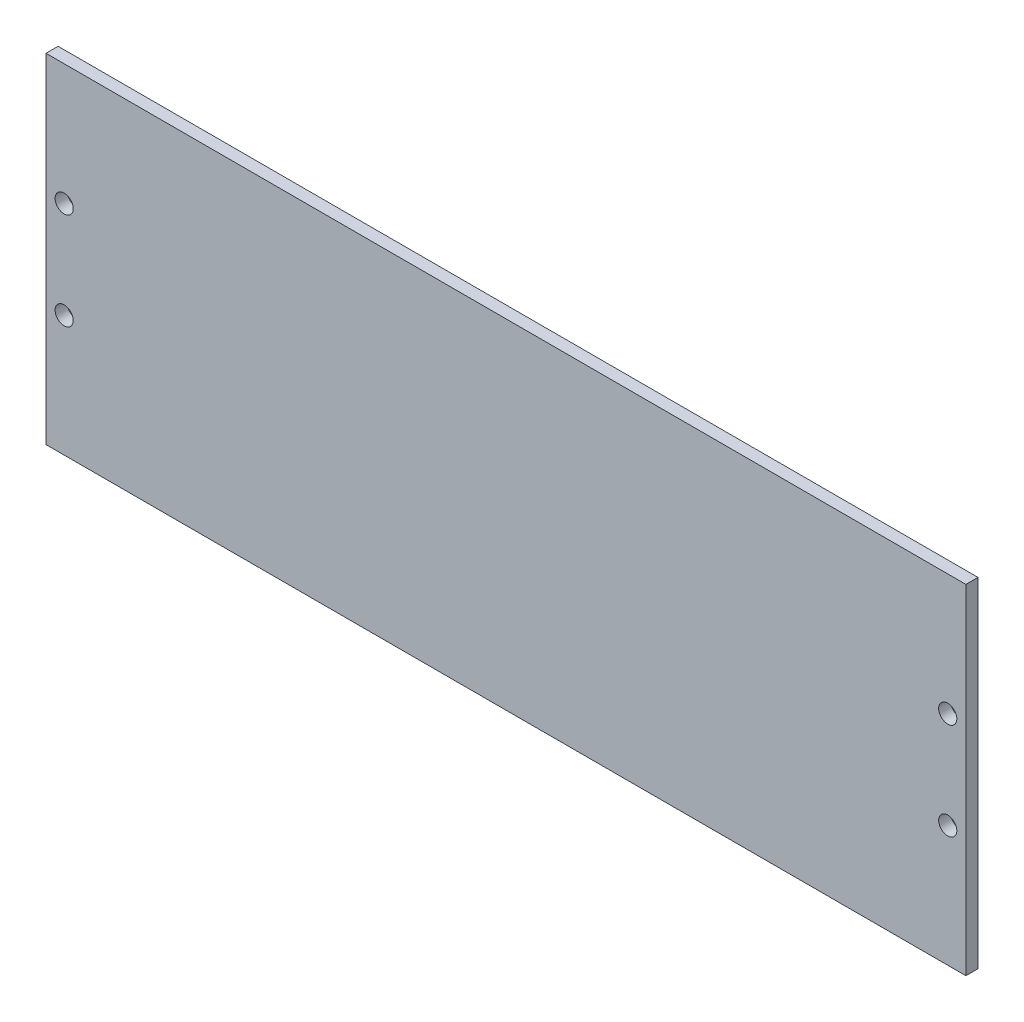
ISO-10303-21;
HEADER;
FILE_DESCRIPTION(('STEP AP214'),'2;1');
FILE_NAME('part.step','',(''),(''),'','','');
FILE_SCHEMA(('AUTOMOTIVE_DESIGN { 1 0 10303 214 1 1 1 1 }'));
ENDSEC;
DATA;
#1=APPLICATION_CONTEXT('core data for automotive mechanical design processes');
#2=APPLICATION_PROTOCOL_DEFINITION('international standard','automotive_design',2000,#1);
#3=PRODUCT_CONTEXT('',#1,'mechanical');
#4=PRODUCT('Part','Part','',(#3));
#5=PRODUCT_RELATED_PRODUCT_CATEGORY('part','',(#4));
#6=PRODUCT_DEFINITION_FORMATION('','',#4);
#7=PRODUCT_DEFINITION_CONTEXT('part definition',#1,'design');
#8=PRODUCT_DEFINITION('design','',#6,#7);
#9=PRODUCT_DEFINITION_SHAPE('','',#8);
#10=(LENGTH_UNIT() NAMED_UNIT(*) SI_UNIT(.MILLI.,.METRE.));
#11=(NAMED_UNIT(*) PLANE_ANGLE_UNIT() SI_UNIT($,.RADIAN.));
#12=(NAMED_UNIT(*) SI_UNIT($,.STERADIAN.) SOLID_ANGLE_UNIT());
#13=UNCERTAINTY_MEASURE_WITH_UNIT(LENGTH_MEASURE(1.E-05),#10,'distance_accuracy_value','');
#14=(GEOMETRIC_REPRESENTATION_CONTEXT(3) GLOBAL_UNCERTAINTY_ASSIGNED_CONTEXT((#13)) GLOBAL_UNIT_ASSIGNED_CONTEXT((#10,
#11,#12)) REPRESENTATION_CONTEXT('',''));
#15=CARTESIAN_POINT('',(0.,0.,0.));
#16=DIRECTION('',(0.,0.,1.));
#17=DIRECTION('',(1.,0.,0.));
#18=AXIS2_PLACEMENT_3D('',#15,#16,#17);
#19=CARTESIAN_POINT('',(0.,0.,2.));
#20=DIRECTION('',(0.,0.,-1.));
#21=DIRECTION('',(-1.,0.,0.));
#22=AXIS2_PLACEMENT_3D('',#19,#20,#21);
#23=PLANE('',#22);
#24=DIRECTION('',(0.,-1.,0.));
#25=VECTOR('',#24,1.);
#26=CARTESIAN_POINT('',(0.,0.,2.));
#27=LINE('',#26,#25);
#28=CARTESIAN_POINT('',(0.,56.,2.));
#29=VERTEX_POINT('',#28);
#30=CARTESIAN_POINT('',(0.,0.,2.));
#31=VERTEX_POINT('',#30);
#32=EDGE_CURVE('E94',#29,#31,#27,.T.);
#33=ORIENTED_EDGE('',*,*,#32,.T.);
#34=DIRECTION('',(1.,0.,0.));
#35=VECTOR('',#34,1.);
#36=CARTESIAN_POINT('',(0.,0.,2.));
#37=LINE('',#36,#35);
#38=CARTESIAN_POINT('',(152.,0.,2.));
#39=VERTEX_POINT('',#38);
#40=EDGE_CURVE('E89',#31,#39,#37,.T.);
#41=ORIENTED_EDGE('',*,*,#40,.T.);
#42=DIRECTION('',(0.,1.,0.));
#43=VECTOR('',#42,1.);
#44=CARTESIAN_POINT('',(152.,0.,2.));
#45=LINE('',#44,#43);
#46=CARTESIAN_POINT('',(152.,56.,2.));
#47=VERTEX_POINT('',#46);
#48=EDGE_CURVE('E92',#39,#47,#45,.T.);
#49=ORIENTED_EDGE('',*,*,#48,.T.);
#50=DIRECTION('',(-1.,0.,0.));
#51=VECTOR('',#50,1.);
#52=CARTESIAN_POINT('',(0.,56.,2.));
#53=LINE('',#52,#51);
#54=EDGE_CURVE('E59',#47,#29,#53,.T.);
#55=ORIENTED_EDGE('',*,*,#54,.T.);
#56=EDGE_LOOP('',(#33,#41,#49,#55));
#57=FACE_BOUND('',#56,.T.);
#58=CARTESIAN_POINT('',(3.,36.,2.));
#59=DIRECTION('',(0.,0.,1.));
#60=DIRECTION('',(1.,0.,0.));
#61=AXIS2_PLACEMENT_3D('',#58,#59,#60);
#62=CIRCLE('',#61,1.5);
#63=CARTESIAN_POINT('',(4.50000000000001,36.,2.));
#64=VERTEX_POINT('',#63);
#65=EDGE_CURVE('E115',#64,#64,#62,.T.);
#66=ORIENTED_EDGE('',*,*,#65,.F.);
#67=EDGE_LOOP('',(#66));
#68=FACE_BOUND('',#67,.T.);
#69=CARTESIAN_POINT('',(3.,20.,2.));
#70=DIRECTION('',(0.,0.,1.));
#71=DIRECTION('',(1.,0.,0.));
#72=AXIS2_PLACEMENT_3D('',#69,#70,#71);
#73=CIRCLE('',#72,1.5);
#74=CARTESIAN_POINT('',(4.50000000000001,20.,2.));
#75=VERTEX_POINT('',#74);
#76=EDGE_CURVE('E139',#75,#75,#73,.T.);
#77=ORIENTED_EDGE('',*,*,#76,.F.);
#78=EDGE_LOOP('',(#77));
#79=FACE_BOUND('',#78,.T.);
#80=CARTESIAN_POINT('',(149.,20.,2.));
#81=DIRECTION('',(0.,0.,1.));
#82=DIRECTION('',(1.,0.,0.));
#83=AXIS2_PLACEMENT_3D('',#80,#81,#82);
#84=CIRCLE('',#83,1.5);
#85=CARTESIAN_POINT('',(150.5,20.,2.));
#86=VERTEX_POINT('',#85);
#87=EDGE_CURVE('E147',#86,#86,#84,.T.);
#88=ORIENTED_EDGE('',*,*,#87,.F.);
#89=EDGE_LOOP('',(#88));
#90=FACE_BOUND('',#89,.T.);
#91=CARTESIAN_POINT('',(149.,36.,2.));
#92=DIRECTION('',(0.,0.,1.));
#93=DIRECTION('',(1.,0.,0.));
#94=AXIS2_PLACEMENT_3D('',#91,#92,#93);
#95=CIRCLE('',#94,1.5);
#96=CARTESIAN_POINT('',(150.5,36.,2.));
#97=VERTEX_POINT('',#96);
#98=EDGE_CURVE('E155',#97,#97,#95,.T.);
#99=ORIENTED_EDGE('',*,*,#98,.F.);
#100=EDGE_LOOP('',(#99));
#101=FACE_BOUND('',#100,.T.);
#102=ADVANCED_FACE('F41',(#57,#68,#79,#90,#101),#23,.F.);
#103=CARTESIAN_POINT('',(0.,0.,0.));
#104=DIRECTION('',(0.,0.,-1.));
#105=DIRECTION('',(-1.,0.,0.));
#106=AXIS2_PLACEMENT_3D('',#103,#104,#105);
#107=PLANE('',#106);
#108=CARTESIAN_POINT('',(149.,20.,0.));
#109=DIRECTION('',(0.,0.,1.));
#110=DIRECTION('',(1.,0.,0.));
#111=AXIS2_PLACEMENT_3D('',#108,#109,#110);
#112=CIRCLE('',#111,1.5);
#113=CARTESIAN_POINT('',(150.5,20.,0.));
#114=VERTEX_POINT('',#113);
#115=EDGE_CURVE('E151',#114,#114,#112,.T.);
#116=ORIENTED_EDGE('',*,*,#115,.T.);
#117=EDGE_LOOP('',(#116));
#118=FACE_BOUND('',#117,.T.);
#119=CARTESIAN_POINT('',(3.,36.,0.));
#120=DIRECTION('',(0.,0.,1.));
#121=DIRECTION('',(1.,0.,0.));
#122=AXIS2_PLACEMENT_3D('',#119,#120,#121);
#123=CIRCLE('',#122,1.5);
#124=CARTESIAN_POINT('',(4.50000000000001,36.,0.));
#125=VERTEX_POINT('',#124);
#126=EDGE_CURVE('E135',#125,#125,#123,.T.);
#127=ORIENTED_EDGE('',*,*,#126,.T.);
#128=EDGE_LOOP('',(#127));
#129=FACE_BOUND('',#128,.T.);
#130=DIRECTION('',(0.,-1.,0.));
#131=VECTOR('',#130,1.);
#132=CARTESIAN_POINT('',(0.,0.,0.));
#133=LINE('',#132,#131);
#134=CARTESIAN_POINT('',(0.,56.,0.));
#135=VERTEX_POINT('',#134);
#136=CARTESIAN_POINT('',(0.,0.,0.));
#137=VERTEX_POINT('',#136);
#138=EDGE_CURVE('E111',#135,#137,#133,.T.);
#139=ORIENTED_EDGE('',*,*,#138,.F.);
#140=DIRECTION('',(-1.,0.,0.));
#141=VECTOR('',#140,1.);
#142=CARTESIAN_POINT('',(0.,56.,0.));
#143=LINE('',#142,#141);
#144=CARTESIAN_POINT('',(152.,56.,0.));
#145=VERTEX_POINT('',#144);
#146=EDGE_CURVE('E82',#145,#135,#143,.T.);
#147=ORIENTED_EDGE('',*,*,#146,.F.);
#148=DIRECTION('',(0.,1.,0.));
#149=VECTOR('',#148,1.);
#150=CARTESIAN_POINT('',(152.,0.,0.));
#151=LINE('',#150,#149);
#152=CARTESIAN_POINT('',(152.,0.,0.));
#153=VERTEX_POINT('',#152);
#154=EDGE_CURVE('E76',#153,#145,#151,.T.);
#155=ORIENTED_EDGE('',*,*,#154,.F.);
#156=DIRECTION('',(1.,0.,0.));
#157=VECTOR('',#156,1.);
#158=CARTESIAN_POINT('',(0.,0.,0.));
#159=LINE('',#158,#157);
#160=EDGE_CURVE('E99',#137,#153,#159,.T.);
#161=ORIENTED_EDGE('',*,*,#160,.F.);
#162=EDGE_LOOP('',(#139,#147,#155,#161));
#163=FACE_BOUND('',#162,.T.);
#164=CARTESIAN_POINT('',(3.,20.,0.));
#165=DIRECTION('',(0.,0.,1.));
#166=DIRECTION('',(1.,0.,0.));
#167=AXIS2_PLACEMENT_3D('',#164,#165,#166);
#168=CIRCLE('',#167,1.5);
#169=CARTESIAN_POINT('',(4.50000000000001,20.,0.));
#170=VERTEX_POINT('',#169);
#171=EDGE_CURVE('E143',#170,#170,#168,.T.);
#172=ORIENTED_EDGE('',*,*,#171,.T.);
#173=EDGE_LOOP('',(#172));
#174=FACE_BOUND('',#173,.T.);
#175=CARTESIAN_POINT('',(149.,36.,0.));
#176=DIRECTION('',(0.,0.,1.));
#177=DIRECTION('',(1.,0.,0.));
#178=AXIS2_PLACEMENT_3D('',#175,#176,#177);
#179=CIRCLE('',#178,1.5);
#180=CARTESIAN_POINT('',(150.5,36.,0.));
#181=VERTEX_POINT('',#180);
#182=EDGE_CURVE('E159',#181,#181,#179,.T.);
#183=ORIENTED_EDGE('',*,*,#182,.T.);
#184=EDGE_LOOP('',(#183));
#185=FACE_BOUND('',#184,.T.);
#186=ADVANCED_FACE('F129',(#118,#129,#163,#174,#185),#107,.T.);
#187=CARTESIAN_POINT('',(0.,0.,2.));
#188=DIRECTION('',(1.,0.,0.));
#189=DIRECTION('',(0.,0.,-1.));
#190=AXIS2_PLACEMENT_3D('',#187,#188,#189);
#191=PLANE('',#190);
#192=ORIENTED_EDGE('',*,*,#138,.T.);
#193=DIRECTION('',(0.,0.,-1.));
#194=VECTOR('',#193,1.);
#195=CARTESIAN_POINT('',(0.,0.,2.));
#196=LINE('',#195,#194);
#197=EDGE_CURVE('E11',#31,#137,#196,.T.);
#198=ORIENTED_EDGE('',*,*,#197,.F.);
#199=ORIENTED_EDGE('',*,*,#32,.F.);
#200=DIRECTION('',(0.,0.,-1.));
#201=VECTOR('',#200,1.);
#202=CARTESIAN_POINT('',(0.,56.,2.));
#203=LINE('',#202,#201);
#204=EDGE_CURVE('E107',#29,#135,#203,.T.);
#205=ORIENTED_EDGE('',*,*,#204,.T.);
#206=EDGE_LOOP('',(#192,#198,#199,#205));
#207=FACE_BOUND('',#206,.T.);
#208=ADVANCED_FACE('F43',(#207),#191,.F.);
#209=CARTESIAN_POINT('',(0.,0.,2.));
#210=DIRECTION('',(0.,1.,0.));
#211=DIRECTION('',(0.,0.,1.));
#212=AXIS2_PLACEMENT_3D('',#209,#210,#211);
#213=PLANE('',#212);
#214=ORIENTED_EDGE('',*,*,#160,.T.);
#215=DIRECTION('',(0.,0.,-1.));
#216=VECTOR('',#215,1.);
#217=CARTESIAN_POINT('',(152.,0.,2.));
#218=LINE('',#217,#216);
#219=EDGE_CURVE('E51',#39,#153,#218,.T.);
#220=ORIENTED_EDGE('',*,*,#219,.F.);
#221=ORIENTED_EDGE('',*,*,#40,.F.);
#222=ORIENTED_EDGE('',*,*,#197,.T.);
#223=EDGE_LOOP('',(#214,#220,#221,#222));
#224=FACE_BOUND('',#223,.T.);
#225=ADVANCED_FACE('F98',(#224),#213,.F.);
#226=CARTESIAN_POINT('',(152.,0.,2.));
#227=DIRECTION('',(-1.,0.,0.));
#228=DIRECTION('',(0.,0.,1.));
#229=AXIS2_PLACEMENT_3D('',#226,#227,#228);
#230=PLANE('',#229);
#231=ORIENTED_EDGE('',*,*,#154,.T.);
#232=DIRECTION('',(0.,0.,-1.));
#233=VECTOR('',#232,1.);
#234=CARTESIAN_POINT('',(152.,56.,2.));
#235=LINE('',#234,#233);
#236=EDGE_CURVE('E101',#47,#145,#235,.T.);
#237=ORIENTED_EDGE('',*,*,#236,.F.);
#238=ORIENTED_EDGE('',*,*,#48,.F.);
#239=ORIENTED_EDGE('',*,*,#219,.T.);
#240=EDGE_LOOP('',(#231,#237,#238,#239));
#241=FACE_BOUND('',#240,.T.);
#242=ADVANCED_FACE('F102',(#241),#230,.F.);
#243=CARTESIAN_POINT('',(0.,56.,2.));
#244=DIRECTION('',(0.,-1.,0.));
#245=DIRECTION('',(0.,0.,-1.));
#246=AXIS2_PLACEMENT_3D('',#243,#244,#245);
#247=PLANE('',#246);
#248=ORIENTED_EDGE('',*,*,#146,.T.);
#249=ORIENTED_EDGE('',*,*,#204,.F.);
#250=ORIENTED_EDGE('',*,*,#54,.F.);
#251=ORIENTED_EDGE('',*,*,#236,.T.);
#252=EDGE_LOOP('',(#248,#249,#250,#251));
#253=FACE_BOUND('',#252,.T.);
#254=ADVANCED_FACE('F126',(#253),#247,.F.);
#255=CARTESIAN_POINT('',(3.,36.,2.));
#256=DIRECTION('',(0.,0.,-1.));
#257=DIRECTION('',(-1.,0.,0.));
#258=AXIS2_PLACEMENT_3D('',#255,#256,#257);
#259=CYLINDRICAL_SURFACE('',#258,1.5);
#260=ORIENTED_EDGE('',*,*,#65,.T.);
#261=EDGE_LOOP('',(#260));
#262=FACE_BOUND('',#261,.T.);
#263=ORIENTED_EDGE('',*,*,#126,.F.);
#264=EDGE_LOOP('',(#263));
#265=FACE_BOUND('',#264,.T.);
#266=ADVANCED_FACE('F179',(#262,#265),#259,.F.);
#267=CARTESIAN_POINT('',(3.,20.,2.));
#268=DIRECTION('',(0.,0.,-1.));
#269=DIRECTION('',(-1.,0.,0.));
#270=AXIS2_PLACEMENT_3D('',#267,#268,#269);
#271=CYLINDRICAL_SURFACE('',#270,1.5);
#272=ORIENTED_EDGE('',*,*,#76,.T.);
#273=EDGE_LOOP('',(#272));
#274=FACE_BOUND('',#273,.T.);
#275=ORIENTED_EDGE('',*,*,#171,.F.);
#276=EDGE_LOOP('',(#275));
#277=FACE_BOUND('',#276,.T.);
#278=ADVANCED_FACE('F254',(#274,#277),#271,.F.);
#279=CARTESIAN_POINT('',(149.,20.,2.));
#280=DIRECTION('',(0.,0.,-1.));
#281=DIRECTION('',(-1.,0.,0.));
#282=AXIS2_PLACEMENT_3D('',#279,#280,#281);
#283=CYLINDRICAL_SURFACE('',#282,1.5);
#284=ORIENTED_EDGE('',*,*,#87,.T.);
#285=EDGE_LOOP('',(#284));
#286=FACE_BOUND('',#285,.T.);
#287=ORIENTED_EDGE('',*,*,#115,.F.);
#288=EDGE_LOOP('',(#287));
#289=FACE_BOUND('',#288,.T.);
#290=ADVANCED_FACE('F265',(#286,#289),#283,.F.);
#291=CARTESIAN_POINT('',(149.,36.,2.));
#292=DIRECTION('',(0.,0.,-1.));
#293=DIRECTION('',(-1.,0.,0.));
#294=AXIS2_PLACEMENT_3D('',#291,#292,#293);
#295=CYLINDRICAL_SURFACE('',#294,1.5);
#296=ORIENTED_EDGE('',*,*,#98,.T.);
#297=EDGE_LOOP('',(#296));
#298=FACE_BOUND('',#297,.T.);
#299=ORIENTED_EDGE('',*,*,#182,.F.);
#300=EDGE_LOOP('',(#299));
#301=FACE_BOUND('',#300,.T.);
#302=ADVANCED_FACE('F168',(#298,#301),#295,.F.);
#303=CLOSED_SHELL('',(#102,#186,#208,#225,#242,#254,#266,#278,#290,#302));
#304=MANIFOLD_SOLID_BREP('B2',#303);
#305=ADVANCED_BREP_SHAPE_REPRESENTATION('',(#18,#304),#14);
#306=SHAPE_DEFINITION_REPRESENTATION(#9,#305);
ENDSEC;
END-ISO-10303-21;
